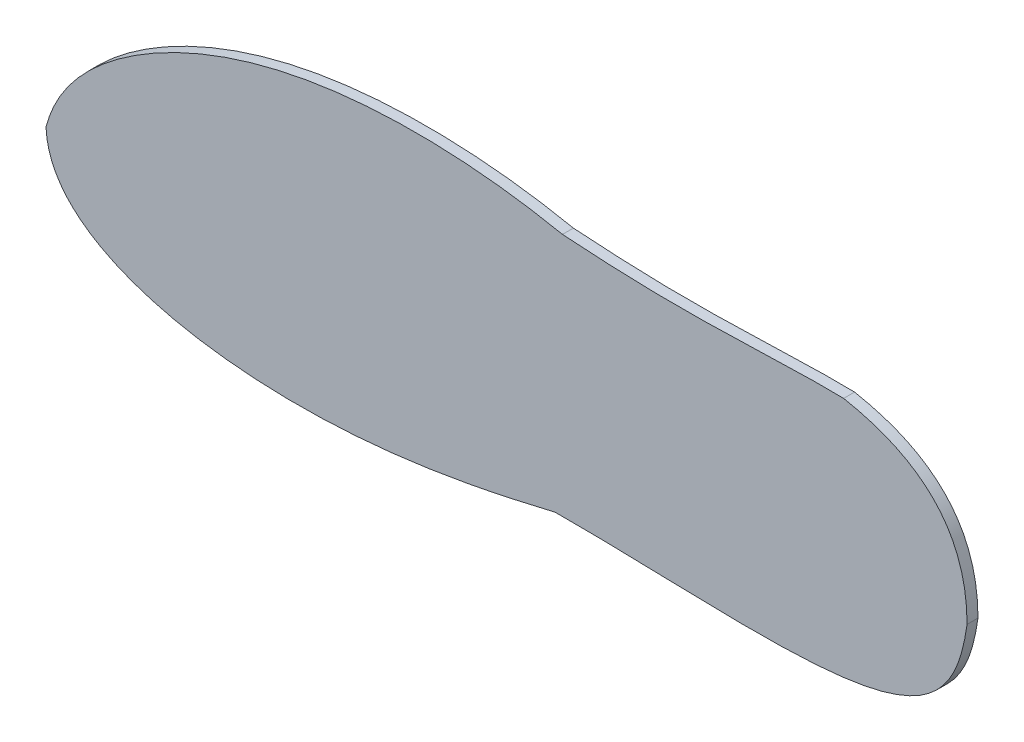
ISO-10303-21;
HEADER;
FILE_DESCRIPTION(('STEP AP214'),'2;1');
FILE_NAME('part.step','',(''),(''),'','','');
FILE_SCHEMA(('AUTOMOTIVE_DESIGN { 1 0 10303 214 1 1 1 1 }'));
ENDSEC;
DATA;
#1=APPLICATION_CONTEXT('core data for automotive mechanical design processes');
#2=APPLICATION_PROTOCOL_DEFINITION('international standard','automotive_design',2000,#1);
#3=PRODUCT_CONTEXT('',#1,'mechanical');
#4=PRODUCT('Part','Part','',(#3));
#5=PRODUCT_RELATED_PRODUCT_CATEGORY('part','',(#4));
#6=PRODUCT_DEFINITION_FORMATION('','',#4);
#7=PRODUCT_DEFINITION_CONTEXT('part definition',#1,'design');
#8=PRODUCT_DEFINITION('design','',#6,#7);
#9=PRODUCT_DEFINITION_SHAPE('','',#8);
#10=(LENGTH_UNIT() NAMED_UNIT(*) SI_UNIT(.MILLI.,.METRE.));
#11=(NAMED_UNIT(*) PLANE_ANGLE_UNIT() SI_UNIT($,.RADIAN.));
#12=(NAMED_UNIT(*) SI_UNIT($,.STERADIAN.) SOLID_ANGLE_UNIT());
#13=UNCERTAINTY_MEASURE_WITH_UNIT(LENGTH_MEASURE(1.E-05),#10,'distance_accuracy_value','');
#14=(GEOMETRIC_REPRESENTATION_CONTEXT(3) GLOBAL_UNCERTAINTY_ASSIGNED_CONTEXT((#13)) GLOBAL_UNIT_ASSIGNED_CONTEXT((#10,
#11,#12)) REPRESENTATION_CONTEXT('',''));
#15=CARTESIAN_POINT('',(0.,0.,0.));
#16=DIRECTION('',(0.,0.,1.));
#17=DIRECTION('',(1.,0.,0.));
#18=AXIS2_PLACEMENT_3D('',#15,#16,#17);
#19=CARTESIAN_POINT('',(-463.953861678565,12.4722236536542,3.));
#20=CARTESIAN_POINT('',(-476.873175605576,12.8137983026856,3.));
#21=CARTESIAN_POINT('',(-492.00246529768,11.7893586333668,3.));
#22=CARTESIAN_POINT('',(-508.394206494495,10.8919071090594,3.));
#23=CARTESIAN_POINT('',(-524.921243659066,11.7750095512127,3.));
#24=CARTESIAN_POINT('',(-541.182053808294,12.8689187718689,3.));
#25=B_SPLINE_CURVE_WITH_KNOTS('',5,(#19,#20,#21,#22,#23,#24),.UNSPECIFIED.,.F.,.F.,(6,6),(0.,
1.),.UNSPECIFIED.);
#26=DIRECTION('',(0.,0.,-1.));
#27=VECTOR('',#26,1.);
#28=SURFACE_OF_LINEAR_EXTRUSION('',#25,#27);
#29=CARTESIAN_POINT('',(-463.953861678565,12.4722236536542,0.));
#30=CARTESIAN_POINT('',(-476.873175605576,12.8137983026856,0.));
#31=CARTESIAN_POINT('',(-492.00246529768,11.7893586333668,0.));
#32=CARTESIAN_POINT('',(-508.394206494495,10.8919071090594,0.));
#33=CARTESIAN_POINT('',(-524.921243659066,11.7750095512127,0.));
#34=CARTESIAN_POINT('',(-541.182053808294,12.8689187718689,0.));
#35=B_SPLINE_CURVE_WITH_KNOTS('',5,(#29,#30,#31,#32,#33,#34),.UNSPECIFIED.,.F.,.F.,(6,6),(0.,
1.),.UNSPECIFIED.);
#36=CARTESIAN_POINT('',(-463.953861678565,12.4722236536542,0.));
#37=VERTEX_POINT('',#36);
#38=CARTESIAN_POINT('',(-541.182053808294,12.8689187718689,0.));
#39=VERTEX_POINT('',#38);
#40=EDGE_CURVE('E190',#37,#39,#35,.T.);
#41=ORIENTED_EDGE('',*,*,#40,.T.);
#42=DIRECTION('',(0.,0.,-1.));
#43=VECTOR('',#42,1.);
#44=CARTESIAN_POINT('',(-541.182053808294,12.8689187718689,3.));
#45=LINE('',#44,#43);
#46=CARTESIAN_POINT('',(-541.182053808294,12.8689187718689,3.));
#47=VERTEX_POINT('',#46);
#48=EDGE_CURVE('E11',#47,#39,#45,.T.);
#49=ORIENTED_EDGE('',*,*,#48,.F.);
#50=CARTESIAN_POINT('',(-463.953861678565,12.4722236536542,3.));
#51=VERTEX_POINT('',#50);
#52=EDGE_CURVE('E151',#51,#47,#25,.T.);
#53=ORIENTED_EDGE('',*,*,#52,.F.);
#54=DIRECTION('',(0.,0.,-1.));
#55=VECTOR('',#54,1.);
#56=CARTESIAN_POINT('',(-463.953861678565,12.4722236536542,3.));
#57=LINE('',#56,#55);
#58=EDGE_CURVE('E122',#51,#37,#57,.T.);
#59=ORIENTED_EDGE('',*,*,#58,.T.);
#60=EDGE_LOOP('',(#41,#49,#53,#59));
#61=FACE_BOUND('',#60,.T.);
#62=ADVANCED_FACE('F43',(#61),#28,.F.);
#63=CARTESIAN_POINT('',(-541.182053808294,12.8689187718689,3.));
#64=CARTESIAN_POINT('',(-585.112390119044,21.9627017837854,3.));
#65=CARTESIAN_POINT('',(-633.497530912964,18.1528481779649,3.));
#66=CARTESIAN_POINT('',(-649.49891605741,1.38949231235479,3.));
#67=CARTESIAN_POINT('',(-676.548876658736,-7.37317098103232,3.));
#68=CARTESIAN_POINT('',(-683.05149565292,-32.5197971281705,3.));
#69=B_SPLINE_CURVE_WITH_KNOTS('',5,(#63,#64,#65,#66,#67,#68),.UNSPECIFIED.,.F.,.F.,(6,6),(0.,
1.),.UNSPECIFIED.);
#70=DIRECTION('',(0.,0.,-1.));
#71=VECTOR('',#70,1.);
#72=SURFACE_OF_LINEAR_EXTRUSION('',#69,#71);
#73=CARTESIAN_POINT('',(-541.182053808294,12.8689187718689,0.));
#74=CARTESIAN_POINT('',(-585.112390119044,21.9627017837854,0.));
#75=CARTESIAN_POINT('',(-633.497530912964,18.1528481779649,0.));
#76=CARTESIAN_POINT('',(-649.49891605741,1.38949231235479,0.));
#77=CARTESIAN_POINT('',(-676.548876658736,-7.37317098103232,0.));
#78=CARTESIAN_POINT('',(-683.05149565292,-32.5197971281705,0.));
#79=B_SPLINE_CURVE_WITH_KNOTS('',5,(#73,#74,#75,#76,#77,#78),.UNSPECIFIED.,.F.,.F.,(6,6),(0.,
1.),.UNSPECIFIED.);
#80=CARTESIAN_POINT('',(-683.05149565292,-32.5197971281705,0.));
#81=VERTEX_POINT('',#80);
#82=EDGE_CURVE('E187',#39,#81,#79,.T.);
#83=ORIENTED_EDGE('',*,*,#82,.T.);
#84=DIRECTION('',(0.,0.,-1.));
#85=VECTOR('',#84,1.);
#86=CARTESIAN_POINT('',(-683.05149565292,-32.5197971281705,3.));
#87=LINE('',#86,#85);
#88=CARTESIAN_POINT('',(-683.05149565292,-32.5197971281705,3.));
#89=VERTEX_POINT('',#88);
#90=EDGE_CURVE('E53',#89,#81,#87,.T.);
#91=ORIENTED_EDGE('',*,*,#90,.F.);
#92=EDGE_CURVE('E95',#47,#89,#69,.T.);
#93=ORIENTED_EDGE('',*,*,#92,.F.);
#94=ORIENTED_EDGE('',*,*,#48,.T.);
#95=EDGE_LOOP('',(#83,#91,#93,#94));
#96=FACE_BOUND('',#95,.T.);
#97=ADVANCED_FACE('F145',(#96),#72,.F.);
#98=CARTESIAN_POINT('',(-683.05149565292,-32.5197971281705,3.));
#99=CARTESIAN_POINT('',(-681.692179026594,-64.9019604289216,3.));
#100=CARTESIAN_POINT('',(-624.734867619577,-67.949843313578,3.));
#101=CARTESIAN_POINT('',(-595.589487535051,-66.4259018712498,3.));
#102=CARTESIAN_POINT('',(-562.634253844703,-58.8061946596088,3.));
#103=CARTESIAN_POINT('',(-543.204000455019,-54.2343703326243,3.));
#104=B_SPLINE_CURVE_WITH_KNOTS('',5,(#98,#99,#100,#101,#102,#103),.UNSPECIFIED.,.F.,.F.,(6,6),
(0.,1.),.UNSPECIFIED.);
#105=DIRECTION('',(0.,0.,-1.));
#106=VECTOR('',#105,1.);
#107=SURFACE_OF_LINEAR_EXTRUSION('',#104,#106);
#108=CARTESIAN_POINT('',(-683.05149565292,-32.5197971281705,0.));
#109=CARTESIAN_POINT('',(-681.692179026594,-64.9019604289216,0.));
#110=CARTESIAN_POINT('',(-624.734867619577,-67.949843313578,0.));
#111=CARTESIAN_POINT('',(-595.589487535051,-66.4259018712498,0.));
#112=CARTESIAN_POINT('',(-562.634253844703,-58.8061946596088,0.));
#113=CARTESIAN_POINT('',(-543.204000455019,-54.2343703326243,0.));
#114=B_SPLINE_CURVE_WITH_KNOTS('',5,(#108,#109,#110,#111,#112,#113),.UNSPECIFIED.,.F.,.F.,(6,6),
(0.,1.),.UNSPECIFIED.);
#115=CARTESIAN_POINT('',(-543.204000455019,-54.2343703326243,0.));
#116=VERTEX_POINT('',#115);
#117=EDGE_CURVE('E111',#81,#116,#114,.T.);
#118=ORIENTED_EDGE('',*,*,#117,.T.);
#119=DIRECTION('',(0.,0.,-1.));
#120=VECTOR('',#119,1.);
#121=CARTESIAN_POINT('',(-543.204000455019,-54.2343703326243,3.));
#122=LINE('',#121,#120);
#123=CARTESIAN_POINT('',(-543.204000455019,-54.2343703326243,3.));
#124=VERTEX_POINT('',#123);
#125=EDGE_CURVE('E108',#124,#116,#122,.T.);
#126=ORIENTED_EDGE('',*,*,#125,.F.);
#127=EDGE_CURVE('E99',#89,#124,#104,.T.);
#128=ORIENTED_EDGE('',*,*,#127,.F.);
#129=ORIENTED_EDGE('',*,*,#90,.T.);
#130=EDGE_LOOP('',(#118,#126,#128,#129));
#131=FACE_BOUND('',#130,.T.);
#132=ADVANCED_FACE('F109',(#131),#107,.F.);
#133=CARTESIAN_POINT('',(-543.204000455019,-54.2343703326243,3.));
#134=CARTESIAN_POINT('',(-500.522723172164,-53.87570413697,3.));
#135=CARTESIAN_POINT('',(-446.698845789447,-60.1013016366893,3.));
#136=CARTESIAN_POINT('',(-433.837325855028,-50.919955669949,3.));
#137=CARTESIAN_POINT('',(-430.046561650368,-24.3212181150691,3.));
#138=B_SPLINE_CURVE_WITH_KNOTS('',4,(#133,#134,#135,#136,#137),.UNSPECIFIED.,.F.,.F.,(5,5),(0.,
1.),.UNSPECIFIED.);
#139=DIRECTION('',(0.,0.,-1.));
#140=VECTOR('',#139,1.);
#141=SURFACE_OF_LINEAR_EXTRUSION('',#138,#140);
#142=CARTESIAN_POINT('',(-543.204000455019,-54.2343703326243,0.));
#143=CARTESIAN_POINT('',(-500.522723172164,-53.87570413697,0.));
#144=CARTESIAN_POINT('',(-446.698845789447,-60.1013016366893,0.));
#145=CARTESIAN_POINT('',(-433.837325855028,-50.919955669949,0.));
#146=CARTESIAN_POINT('',(-430.046561650368,-24.3212181150691,0.));
#147=B_SPLINE_CURVE_WITH_KNOTS('',4,(#142,#143,#144,#145,#146),.UNSPECIFIED.,.F.,.F.,(5,5),(0.,
1.),.UNSPECIFIED.);
#148=CARTESIAN_POINT('',(-430.046561650368,-24.3212181150691,0.));
#149=VERTEX_POINT('',#148);
#150=EDGE_CURVE('E81',#116,#149,#147,.T.);
#151=ORIENTED_EDGE('',*,*,#150,.T.);
#152=DIRECTION('',(0.,0.,-1.));
#153=VECTOR('',#152,1.);
#154=CARTESIAN_POINT('',(-430.046561650368,-24.3212181150691,3.));
#155=LINE('',#154,#153);
#156=CARTESIAN_POINT('',(-430.046561650368,-24.3212181150691,3.));
#157=VERTEX_POINT('',#156);
#158=EDGE_CURVE('E113',#157,#149,#155,.T.);
#159=ORIENTED_EDGE('',*,*,#158,.F.);
#160=EDGE_CURVE('E103',#124,#157,#138,.T.);
#161=ORIENTED_EDGE('',*,*,#160,.F.);
#162=ORIENTED_EDGE('',*,*,#125,.T.);
#163=EDGE_LOOP('',(#151,#159,#161,#162));
#164=FACE_BOUND('',#163,.T.);
#165=ADVANCED_FACE('F115',(#164),#141,.F.);
#166=CARTESIAN_POINT('',(-430.046561650368,-24.3212181150691,3.));
#167=CARTESIAN_POINT('',(-430.046561650368,6.11704139445569,3.));
#168=CARTESIAN_POINT('',(-463.953861678565,12.4722236536542,3.));
#169=B_SPLINE_CURVE_WITH_KNOTS('',2,(#166,#167,#168),.UNSPECIFIED.,.F.,.F.,(3,3),(0.,1.),.UNSPECIFIED.);
#170=DIRECTION('',(0.,0.,-1.));
#171=VECTOR('',#170,1.);
#172=SURFACE_OF_LINEAR_EXTRUSION('',#169,#171);
#173=CARTESIAN_POINT('',(-430.046561650368,-24.3212181150691,0.));
#174=CARTESIAN_POINT('',(-430.046561650368,6.11704139445569,0.));
#175=CARTESIAN_POINT('',(-463.953861678565,12.4722236536542,0.));
#176=B_SPLINE_CURVE_WITH_KNOTS('',2,(#173,#174,#175),.UNSPECIFIED.,.F.,.F.,(3,3),(0.,1.),.UNSPECIFIED.);
#177=EDGE_CURVE('E87',#149,#37,#176,.T.);
#178=ORIENTED_EDGE('',*,*,#177,.T.);
#179=ORIENTED_EDGE('',*,*,#58,.F.);
#180=EDGE_CURVE('E61',#157,#51,#169,.T.);
#181=ORIENTED_EDGE('',*,*,#180,.F.);
#182=ORIENTED_EDGE('',*,*,#158,.T.);
#183=EDGE_LOOP('',(#178,#179,#181,#182));
#184=FACE_BOUND('',#183,.T.);
#185=ADVANCED_FACE('F142',(#184),#172,.F.);
#186=CARTESIAN_POINT('',(-500.564835304119,11.7218074724774,3.));
#187=DIRECTION('',(0.,0.,-1.));
#188=DIRECTION('',(-1.,0.,0.));
#189=AXIS2_PLACEMENT_3D('',#186,#187,#188);
#190=PLANE('',#189);
#191=ORIENTED_EDGE('',*,*,#52,.T.);
#192=ORIENTED_EDGE('',*,*,#92,.T.);
#193=ORIENTED_EDGE('',*,*,#127,.T.);
#194=ORIENTED_EDGE('',*,*,#160,.T.);
#195=ORIENTED_EDGE('',*,*,#180,.T.);
#196=EDGE_LOOP('',(#191,#192,#193,#194,#195));
#197=FACE_BOUND('',#196,.T.);
#198=ADVANCED_FACE('F101',(#197),#190,.F.);
#199=CARTESIAN_POINT('',(-500.564835304119,11.7218074724774,0.));
#200=DIRECTION('',(0.,0.,-1.));
#201=DIRECTION('',(-1.,0.,0.));
#202=AXIS2_PLACEMENT_3D('',#199,#200,#201);
#203=PLANE('',#202);
#204=ORIENTED_EDGE('',*,*,#40,.F.);
#205=ORIENTED_EDGE('',*,*,#177,.F.);
#206=ORIENTED_EDGE('',*,*,#150,.F.);
#207=ORIENTED_EDGE('',*,*,#117,.F.);
#208=ORIENTED_EDGE('',*,*,#82,.F.);
#209=EDGE_LOOP('',(#204,#205,#206,#207,#208));
#210=FACE_BOUND('',#209,.T.);
#211=ADVANCED_FACE('F186',(#210),#203,.T.);
#212=CLOSED_SHELL('',(#62,#97,#132,#165,#185,#198,#211));
#213=MANIFOLD_SOLID_BREP('B2',#212);
#214=ADVANCED_BREP_SHAPE_REPRESENTATION('',(#18,#213),#14);
#215=SHAPE_DEFINITION_REPRESENTATION(#9,#214);
ENDSEC;
END-ISO-10303-21;
